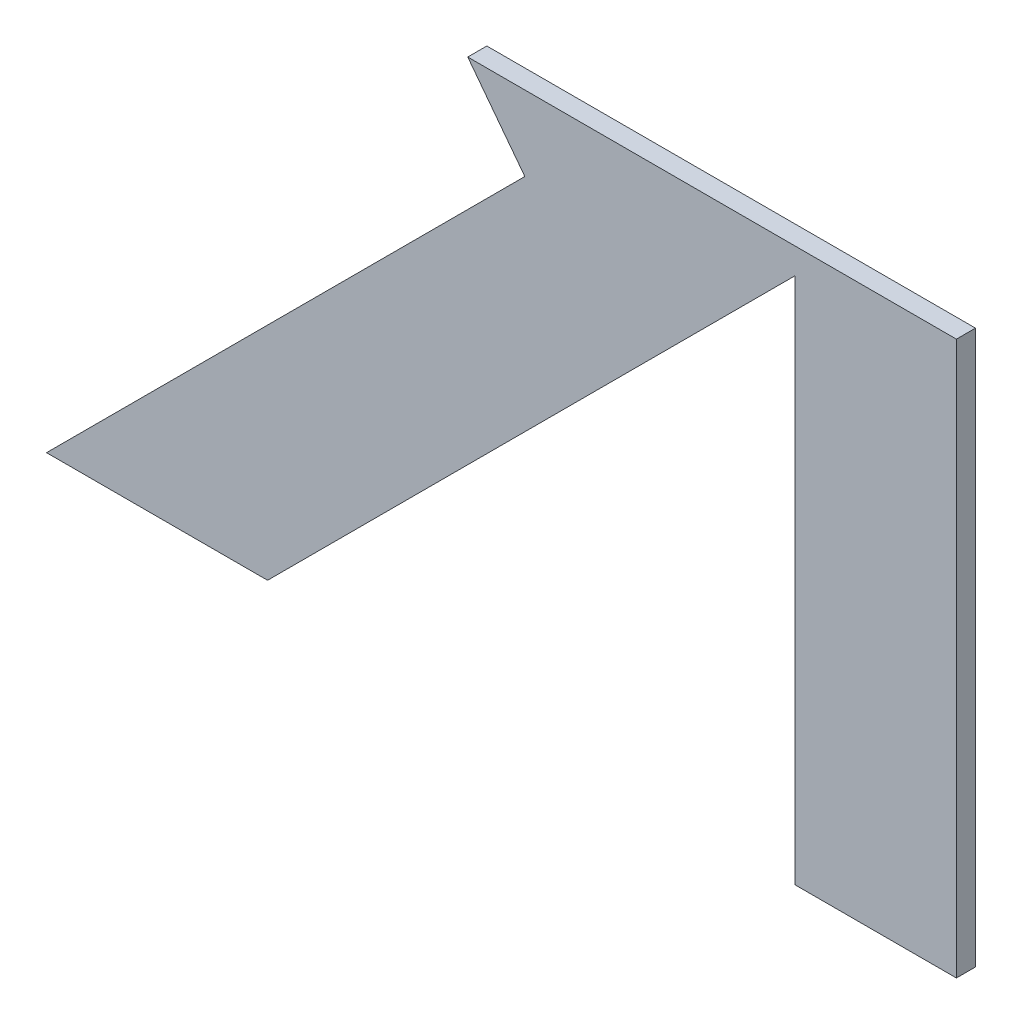
ISO-10303-21;
HEADER;
FILE_DESCRIPTION(('STEP AP214'),'2;1');
FILE_NAME('part.step','',(''),(''),'','','');
FILE_SCHEMA(('AUTOMOTIVE_DESIGN { 1 0 10303 214 1 1 1 1 }'));
ENDSEC;
DATA;
#1=APPLICATION_CONTEXT('core data for automotive mechanical design processes');
#2=APPLICATION_PROTOCOL_DEFINITION('international standard','automotive_design',2000,#1);
#3=PRODUCT_CONTEXT('',#1,'mechanical');
#4=PRODUCT('Part','Part','',(#3));
#5=PRODUCT_RELATED_PRODUCT_CATEGORY('part','',(#4));
#6=PRODUCT_DEFINITION_FORMATION('','',#4);
#7=PRODUCT_DEFINITION_CONTEXT('part definition',#1,'design');
#8=PRODUCT_DEFINITION('design','',#6,#7);
#9=PRODUCT_DEFINITION_SHAPE('','',#8);
#10=(LENGTH_UNIT() NAMED_UNIT(*) SI_UNIT(.MILLI.,.METRE.));
#11=(NAMED_UNIT(*) PLANE_ANGLE_UNIT() SI_UNIT($,.RADIAN.));
#12=(NAMED_UNIT(*) SI_UNIT($,.STERADIAN.) SOLID_ANGLE_UNIT());
#13=UNCERTAINTY_MEASURE_WITH_UNIT(LENGTH_MEASURE(1.E-05),#10,'distance_accuracy_value','');
#14=(GEOMETRIC_REPRESENTATION_CONTEXT(3) GLOBAL_UNCERTAINTY_ASSIGNED_CONTEXT((#13)) GLOBAL_UNIT_ASSIGNED_CONTEXT((#10,
#11,#12)) REPRESENTATION_CONTEXT('',''));
#15=CARTESIAN_POINT('',(0.,0.,0.));
#16=DIRECTION('',(0.,0.,1.));
#17=DIRECTION('',(1.,0.,0.));
#18=AXIS2_PLACEMENT_3D('',#15,#16,#17);
#19=CARTESIAN_POINT('',(-13.4615384615395,-15.,0.5));
#20=DIRECTION('',(0.707106781186547,-0.707106781186548,0.));
#21=DIRECTION('',(0.707106781186548,0.707106781186547,0.));
#22=AXIS2_PLACEMENT_3D('',#19,#20,#21);
#23=PLANE('',#22);
#24=DIRECTION('',(0.707106781186548,0.707106781186547,0.));
#25=VECTOR('',#24,1.);
#26=CARTESIAN_POINT('',(-13.4615384615395,-15.,1.));
#27=LINE('',#26,#25);
#28=CARTESIAN_POINT('',(-13.4615384615395,-15.,1.));
#29=VERTEX_POINT('',#28);
#30=CARTESIAN_POINT('',(-0.925480769231801,-2.46394230769231,1.));
#31=VERTEX_POINT('',#30);
#32=EDGE_CURVE('E124',#29,#31,#27,.T.);
#33=ORIENTED_EDGE('',*,*,#32,.T.);
#34=DIRECTION('',(0.,0.,1.));
#35=VECTOR('',#34,1.);
#36=CARTESIAN_POINT('',(-0.925480769231801,-2.46394230769231,0.5));
#37=LINE('',#36,#35);
#38=CARTESIAN_POINT('',(-0.925480769231801,-2.46394230769231,0.5));
#39=VERTEX_POINT('',#38);
#40=EDGE_CURVE('E107',#39,#31,#37,.T.);
#41=ORIENTED_EDGE('',*,*,#40,.F.);
#42=DIRECTION('',(0.707106781186548,0.707106781186547,0.));
#43=VECTOR('',#42,1.);
#44=CARTESIAN_POINT('',(-13.4615384615395,-15.,0.5));
#45=LINE('',#44,#43);
#46=CARTESIAN_POINT('',(-13.4615384615395,-15.,0.5));
#47=VERTEX_POINT('',#46);
#48=EDGE_CURVE('E118',#47,#39,#45,.T.);
#49=ORIENTED_EDGE('',*,*,#48,.F.);
#50=DIRECTION('',(0.,0.,1.));
#51=VECTOR('',#50,1.);
#52=CARTESIAN_POINT('',(-13.4615384615395,-15.,0.5));
#53=LINE('',#52,#51);
#54=EDGE_CURVE('E130',#47,#29,#53,.T.);
#55=ORIENTED_EDGE('',*,*,#54,.T.);
#56=EDGE_LOOP('',(#33,#41,#49,#55));
#57=FACE_BOUND('',#56,.T.);
#58=ADVANCED_FACE('F39',(#57),#23,.F.);
#59=CARTESIAN_POINT('',(-7.66826923077026,-15.,0.5));
#60=DIRECTION('',(0.,1.,0.));
#61=DIRECTION('',(0.,0.,1.));
#62=AXIS2_PLACEMENT_3D('',#59,#60,#61);
#63=PLANE('',#62);
#64=DIRECTION('',(-1.,0.,0.));
#65=VECTOR('',#64,1.);
#66=CARTESIAN_POINT('',(-7.66826923077026,-15.,1.));
#67=LINE('',#66,#65);
#68=CARTESIAN_POINT('',(-7.66826923077026,-15.,1.));
#69=VERTEX_POINT('',#68);
#70=EDGE_CURVE('E126',#69,#29,#67,.T.);
#71=ORIENTED_EDGE('',*,*,#70,.T.);
#72=ORIENTED_EDGE('',*,*,#54,.F.);
#73=DIRECTION('',(-1.,0.,0.));
#74=VECTOR('',#73,1.);
#75=CARTESIAN_POINT('',(-7.66826923077026,-15.,0.5));
#76=LINE('',#75,#74);
#77=CARTESIAN_POINT('',(-7.66826923077026,-15.,0.5));
#78=VERTEX_POINT('',#77);
#79=EDGE_CURVE('E141',#78,#47,#76,.T.);
#80=ORIENTED_EDGE('',*,*,#79,.F.);
#81=DIRECTION('',(0.,0.,1.));
#82=VECTOR('',#81,1.);
#83=CARTESIAN_POINT('',(-7.66826923077026,-15.,0.5));
#84=LINE('',#83,#82);
#85=EDGE_CURVE('E127',#78,#69,#84,.T.);
#86=ORIENTED_EDGE('',*,*,#85,.T.);
#87=EDGE_LOOP('',(#71,#72,#80,#86));
#88=FACE_BOUND('',#87,.T.);
#89=ADVANCED_FACE('F175',(#88),#63,.F.);
#90=CARTESIAN_POINT('',(6.15384615384512,-1.17788461538462,0.5));
#91=DIRECTION('',(-0.707106781186547,0.707106781186547,0.));
#92=DIRECTION('',(-0.707106781186548,-0.707106781186548,0.));
#93=AXIS2_PLACEMENT_3D('',#90,#91,#92);
#94=PLANE('',#93);
#95=DIRECTION('',(-0.707106781186547,-0.707106781186547,0.));
#96=VECTOR('',#95,1.);
#97=CARTESIAN_POINT('',(6.15384615384512,-1.17788461538462,1.));
#98=LINE('',#97,#96);
#99=CARTESIAN_POINT('',(6.15384615384512,-1.17788461538462,1.));
#100=VERTEX_POINT('',#99);
#101=EDGE_CURVE('E131',#100,#69,#98,.T.);
#102=ORIENTED_EDGE('',*,*,#101,.T.);
#103=ORIENTED_EDGE('',*,*,#85,.F.);
#104=DIRECTION('',(-0.707106781186547,-0.707106781186547,0.));
#105=VECTOR('',#104,1.);
#106=CARTESIAN_POINT('',(6.15384615384512,-1.17788461538462,0.5));
#107=LINE('',#106,#105);
#108=CARTESIAN_POINT('',(6.15384615384512,-1.17788461538462,0.5));
#109=VERTEX_POINT('',#108);
#110=EDGE_CURVE('E142',#109,#78,#107,.T.);
#111=ORIENTED_EDGE('',*,*,#110,.F.);
#112=DIRECTION('',(0.,0.,1.));
#113=VECTOR('',#112,1.);
#114=CARTESIAN_POINT('',(6.15384615384512,-1.17788461538462,0.5));
#115=LINE('',#114,#113);
#116=EDGE_CURVE('E133',#109,#100,#115,.T.);
#117=ORIENTED_EDGE('',*,*,#116,.T.);
#118=EDGE_LOOP('',(#102,#103,#111,#117));
#119=FACE_BOUND('',#118,.T.);
#120=ADVANCED_FACE('F176',(#119),#94,.F.);
#121=CARTESIAN_POINT('',(6.15384615384512,-15.,0.5));
#122=DIRECTION('',(1.,0.,0.));
#123=DIRECTION('',(0.,0.,-1.));
#124=AXIS2_PLACEMENT_3D('',#121,#122,#123);
#125=PLANE('',#124);
#126=DIRECTION('',(0.,1.,0.));
#127=VECTOR('',#126,1.);
#128=CARTESIAN_POINT('',(6.15384615384512,-15.,1.));
#129=LINE('',#128,#127);
#130=CARTESIAN_POINT('',(6.15384615384512,-15.,1.));
#131=VERTEX_POINT('',#130);
#132=EDGE_CURVE('E132',#131,#100,#129,.T.);
#133=ORIENTED_EDGE('',*,*,#132,.T.);
#134=ORIENTED_EDGE('',*,*,#116,.F.);
#135=DIRECTION('',(0.,1.,0.));
#136=VECTOR('',#135,1.);
#137=CARTESIAN_POINT('',(6.15384615384512,-15.,0.5));
#138=LINE('',#137,#136);
#139=CARTESIAN_POINT('',(6.15384615384512,-15.,0.5));
#140=VERTEX_POINT('',#139);
#141=EDGE_CURVE('E144',#140,#109,#138,.T.);
#142=ORIENTED_EDGE('',*,*,#141,.F.);
#143=DIRECTION('',(0.,0.,1.));
#144=VECTOR('',#143,1.);
#145=CARTESIAN_POINT('',(6.15384615384512,-15.,0.5));
#146=LINE('',#145,#144);
#147=EDGE_CURVE('E136',#140,#131,#146,.T.);
#148=ORIENTED_EDGE('',*,*,#147,.T.);
#149=EDGE_LOOP('',(#133,#134,#142,#148));
#150=FACE_BOUND('',#149,.T.);
#151=ADVANCED_FACE('F179',(#150),#125,.F.);
#152=CARTESIAN_POINT('',(10.3846153846144,-15.,0.5));
#153=DIRECTION('',(0.,1.,0.));
#154=DIRECTION('',(0.,0.,1.));
#155=AXIS2_PLACEMENT_3D('',#152,#153,#154);
#156=PLANE('',#155);
#157=DIRECTION('',(-1.,0.,0.));
#158=VECTOR('',#157,1.);
#159=CARTESIAN_POINT('',(10.3846153846144,-15.,1.));
#160=LINE('',#159,#158);
#161=CARTESIAN_POINT('',(10.3846153846144,-15.,1.));
#162=VERTEX_POINT('',#161);
#163=EDGE_CURVE('E140',#162,#131,#160,.T.);
#164=ORIENTED_EDGE('',*,*,#163,.T.);
#165=ORIENTED_EDGE('',*,*,#147,.F.);
#166=DIRECTION('',(-1.,0.,0.));
#167=VECTOR('',#166,1.);
#168=CARTESIAN_POINT('',(10.3846153846144,-15.,0.5));
#169=LINE('',#168,#167);
#170=CARTESIAN_POINT('',(10.3846153846144,-15.,0.5));
#171=VERTEX_POINT('',#170);
#172=EDGE_CURVE('E150',#171,#140,#169,.T.);
#173=ORIENTED_EDGE('',*,*,#172,.F.);
#174=DIRECTION('',(0.,0.,1.));
#175=VECTOR('',#174,1.);
#176=CARTESIAN_POINT('',(10.3846153846144,-15.,0.5));
#177=LINE('',#176,#175);
#178=EDGE_CURVE('E138',#171,#162,#177,.T.);
#179=ORIENTED_EDGE('',*,*,#178,.T.);
#180=EDGE_LOOP('',(#164,#165,#173,#179));
#181=FACE_BOUND('',#180,.T.);
#182=ADVANCED_FACE('F185',(#181),#156,.F.);
#183=CARTESIAN_POINT('',(0.,0.,0.5));
#184=DIRECTION('',(0.,0.,-1.));
#185=DIRECTION('',(-1.,0.,0.));
#186=AXIS2_PLACEMENT_3D('',#183,#184,#185);
#187=PLANE('',#186);
#188=DIRECTION('',(-1.,0.,0.));
#189=VECTOR('',#188,1.);
#190=CARTESIAN_POINT('',(0.,-0.5,0.5));
#191=LINE('',#190,#189);
#192=CARTESIAN_POINT('',(10.3846153846144,-0.5,0.5));
#193=VERTEX_POINT('',#192);
#194=CARTESIAN_POINT('',(-2.42175340145161,-0.5,0.5));
#195=VERTEX_POINT('',#194);
#196=EDGE_CURVE('E11',#193,#195,#191,.T.);
#197=ORIENTED_EDGE('',*,*,#196,.F.);
#198=DIRECTION('',(0.,-1.,0.));
#199=VECTOR('',#198,1.);
#200=CARTESIAN_POINT('',(10.3846153846144,15.,0.5));
#201=LINE('',#200,#199);
#202=EDGE_CURVE('E146',#193,#171,#201,.T.);
#203=ORIENTED_EDGE('',*,*,#202,.T.);
#204=ORIENTED_EDGE('',*,*,#172,.T.);
#205=ORIENTED_EDGE('',*,*,#141,.T.);
#206=ORIENTED_EDGE('',*,*,#110,.T.);
#207=ORIENTED_EDGE('',*,*,#79,.T.);
#208=ORIENTED_EDGE('',*,*,#48,.T.);
#209=DIRECTION('',(-0.606026720954855,0.795444286854024,0.));
#210=VECTOR('',#209,1.);
#211=CARTESIAN_POINT('',(-0.925480769231801,-2.46394230769231,0.5));
#212=LINE('',#211,#210);
#213=EDGE_CURVE('E120',#39,#195,#212,.T.);
#214=ORIENTED_EDGE('',*,*,#213,.T.);
#215=EDGE_LOOP('',(#197,#203,#204,#205,#206,#207,#208,#214));
#216=FACE_BOUND('',#215,.T.);
#217=ADVANCED_FACE('F183',(#216),#187,.T.);
#218=CARTESIAN_POINT('',(-0.925480769231801,-2.46394230769231,0.5));
#219=DIRECTION('',(0.795444286854024,0.606026720954855,0.));
#220=DIRECTION('',(-0.606026720954855,0.795444286854024,0.));
#221=AXIS2_PLACEMENT_3D('',#218,#219,#220);
#222=PLANE('',#221);
#223=DIRECTION('',(-0.606026720954855,0.795444286854024,0.));
#224=VECTOR('',#223,1.);
#225=CARTESIAN_POINT('',(-0.925480769231801,-2.46394230769231,1.));
#226=LINE('',#225,#224);
#227=CARTESIAN_POINT('',(-2.42175340145161,-0.5,1.));
#228=VERTEX_POINT('',#227);
#229=EDGE_CURVE('E109',#31,#228,#226,.T.);
#230=ORIENTED_EDGE('',*,*,#229,.T.);
#231=DIRECTION('',(0.,0.,-1.));
#232=VECTOR('',#231,1.);
#233=CARTESIAN_POINT('',(-2.42175340145161,-0.5,0.5));
#234=LINE('',#233,#232);
#235=EDGE_CURVE('E98',#228,#195,#234,.T.);
#236=ORIENTED_EDGE('',*,*,#235,.T.);
#237=ORIENTED_EDGE('',*,*,#213,.F.);
#238=ORIENTED_EDGE('',*,*,#40,.T.);
#239=EDGE_LOOP('',(#230,#236,#237,#238));
#240=FACE_BOUND('',#239,.T.);
#241=ADVANCED_FACE('F117',(#240),#222,.F.);
#242=CARTESIAN_POINT('',(10.3846153846144,15.,0.5));
#243=DIRECTION('',(-1.,0.,0.));
#244=DIRECTION('',(0.,0.,1.));
#245=AXIS2_PLACEMENT_3D('',#242,#243,#244);
#246=PLANE('',#245);
#247=ORIENTED_EDGE('',*,*,#202,.F.);
#248=DIRECTION('',(0.,0.,1.));
#249=VECTOR('',#248,1.);
#250=CARTESIAN_POINT('',(10.3846153846144,-0.5,0.5));
#251=LINE('',#250,#249);
#252=CARTESIAN_POINT('',(10.3846153846144,-0.5,1.));
#253=VERTEX_POINT('',#252);
#254=EDGE_CURVE('E57',#193,#253,#251,.T.);
#255=ORIENTED_EDGE('',*,*,#254,.T.);
#256=DIRECTION('',(0.,-1.,0.));
#257=VECTOR('',#256,1.);
#258=CARTESIAN_POINT('',(10.3846153846144,15.,1.));
#259=LINE('',#258,#257);
#260=EDGE_CURVE('E43',#253,#162,#259,.T.);
#261=ORIENTED_EDGE('',*,*,#260,.T.);
#262=ORIENTED_EDGE('',*,*,#178,.F.);
#263=EDGE_LOOP('',(#247,#255,#261,#262));
#264=FACE_BOUND('',#263,.T.);
#265=ADVANCED_FACE('F184',(#264),#246,.F.);
#266=CARTESIAN_POINT('',(0.,0.,1.));
#267=DIRECTION('',(0.,0.,-1.));
#268=DIRECTION('',(-1.,0.,0.));
#269=AXIS2_PLACEMENT_3D('',#266,#267,#268);
#270=PLANE('',#269);
#271=ORIENTED_EDGE('',*,*,#260,.F.);
#272=DIRECTION('',(-1.,0.,0.));
#273=VECTOR('',#272,1.);
#274=CARTESIAN_POINT('',(-17.,-0.5,1.));
#275=LINE('',#274,#273);
#276=EDGE_CURVE('E47',#253,#228,#275,.T.);
#277=ORIENTED_EDGE('',*,*,#276,.T.);
#278=ORIENTED_EDGE('',*,*,#229,.F.);
#279=ORIENTED_EDGE('',*,*,#32,.F.);
#280=ORIENTED_EDGE('',*,*,#70,.F.);
#281=ORIENTED_EDGE('',*,*,#101,.F.);
#282=ORIENTED_EDGE('',*,*,#132,.F.);
#283=ORIENTED_EDGE('',*,*,#163,.F.);
#284=EDGE_LOOP('',(#271,#277,#278,#279,#280,#281,#282,#283));
#285=FACE_BOUND('',#284,.T.);
#286=ADVANCED_FACE('F41',(#285),#270,.F.);
#287=CARTESIAN_POINT('',(-17.,-0.5,1.));
#288=DIRECTION('',(0.,-1.,0.));
#289=DIRECTION('',(0.,0.,-1.));
#290=AXIS2_PLACEMENT_3D('',#287,#288,#289);
#291=PLANE('',#290);
#292=ORIENTED_EDGE('',*,*,#196,.T.);
#293=ORIENTED_EDGE('',*,*,#235,.F.);
#294=ORIENTED_EDGE('',*,*,#276,.F.);
#295=ORIENTED_EDGE('',*,*,#254,.F.);
#296=EDGE_LOOP('',(#292,#293,#294,#295));
#297=FACE_BOUND('',#296,.T.);
#298=ADVANCED_FACE('F102',(#297),#291,.F.);
#299=CLOSED_SHELL('',(#58,#89,#120,#151,#182,#217,#241,#265,#286,#298));
#300=MANIFOLD_SOLID_BREP('B2',#299);
#301=ADVANCED_BREP_SHAPE_REPRESENTATION('',(#18,#300),#14);
#302=SHAPE_DEFINITION_REPRESENTATION(#9,#301);
ENDSEC;
END-ISO-10303-21;
